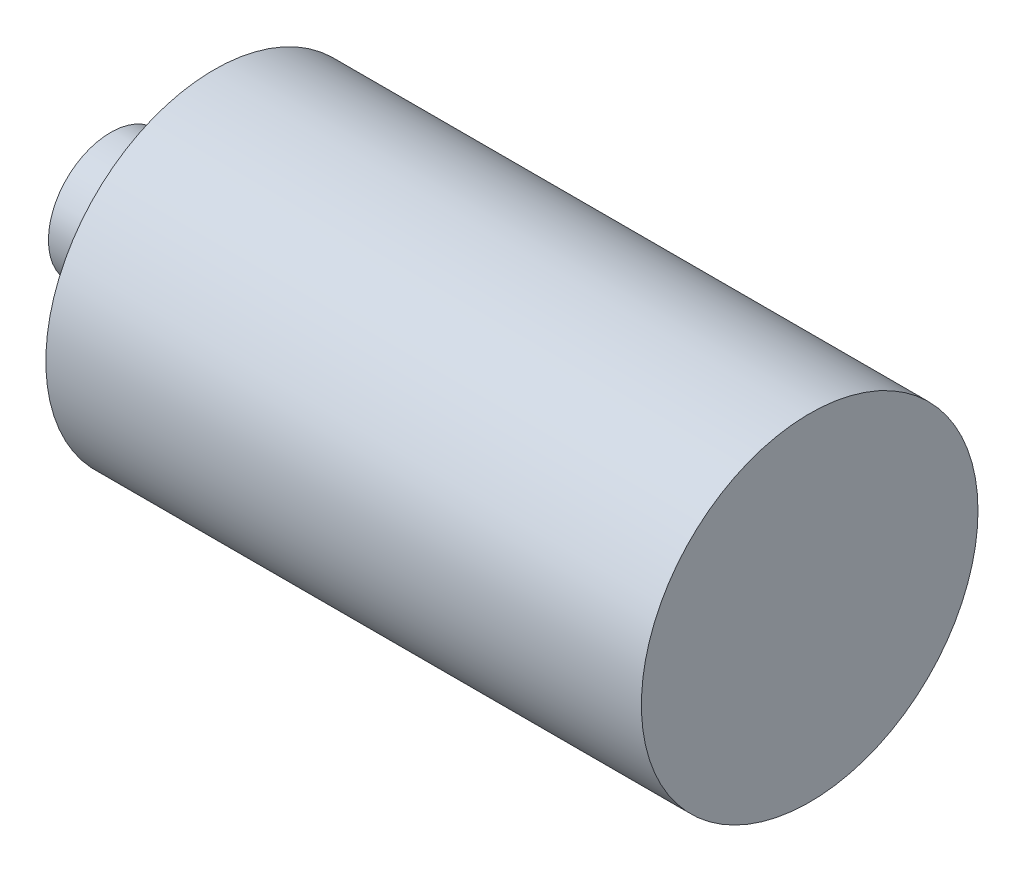
ISO-10303-21;
HEADER;
FILE_DESCRIPTION(('STEP AP214'),'2;1');
FILE_NAME('part.step','',(''),(''),'','','');
FILE_SCHEMA(('AUTOMOTIVE_DESIGN { 1 0 10303 214 1 1 1 1 }'));
ENDSEC;
DATA;
#1=APPLICATION_CONTEXT('core data for automotive mechanical design processes');
#2=APPLICATION_PROTOCOL_DEFINITION('international standard','automotive_design',2000,#1);
#3=PRODUCT_CONTEXT('',#1,'mechanical');
#4=PRODUCT('Part','Part','',(#3));
#5=PRODUCT_RELATED_PRODUCT_CATEGORY('part','',(#4));
#6=PRODUCT_DEFINITION_FORMATION('','',#4);
#7=PRODUCT_DEFINITION_CONTEXT('part definition',#1,'design');
#8=PRODUCT_DEFINITION('design','',#6,#7);
#9=PRODUCT_DEFINITION_SHAPE('','',#8);
#10=(LENGTH_UNIT() NAMED_UNIT(*) SI_UNIT(.MILLI.,.METRE.));
#11=(NAMED_UNIT(*) PLANE_ANGLE_UNIT() SI_UNIT($,.RADIAN.));
#12=(NAMED_UNIT(*) SI_UNIT($,.STERADIAN.) SOLID_ANGLE_UNIT());
#13=UNCERTAINTY_MEASURE_WITH_UNIT(LENGTH_MEASURE(1.E-05),#10,'distance_accuracy_value','');
#14=(GEOMETRIC_REPRESENTATION_CONTEXT(3) GLOBAL_UNCERTAINTY_ASSIGNED_CONTEXT((#13)) GLOBAL_UNIT_ASSIGNED_CONTEXT((#10,
#11,#12)) REPRESENTATION_CONTEXT('',''));
#15=CARTESIAN_POINT('',(0.,0.,0.));
#16=DIRECTION('',(0.,0.,1.));
#17=DIRECTION('',(1.,0.,0.));
#18=AXIS2_PLACEMENT_3D('',#15,#16,#17);
#19=CARTESIAN_POINT('',(11.5,0.,0.));
#20=DIRECTION('',(-1.,0.,0.));
#21=DIRECTION('',(0.,0.,1.));
#22=AXIS2_PLACEMENT_3D('',#19,#20,#21);
#23=CYLINDRICAL_SURFACE('',#22,3.25);
#24=CARTESIAN_POINT('',(11.5,0.,0.));
#25=DIRECTION('',(1.,0.,0.));
#26=DIRECTION('',(0.,0.,-1.));
#27=AXIS2_PLACEMENT_3D('',#24,#25,#26);
#28=CIRCLE('',#27,3.25);
#29=CARTESIAN_POINT('',(11.5,0.,-3.25));
#30=VERTEX_POINT('',#29);
#31=EDGE_CURVE('E38',#30,#30,#28,.T.);
#32=ORIENTED_EDGE('',*,*,#31,.F.);
#33=EDGE_LOOP('',(#32));
#34=FACE_BOUND('',#33,.T.);
#35=CARTESIAN_POINT('',(0.,0.,0.));
#36=DIRECTION('',(1.,0.,0.));
#37=DIRECTION('',(0.,0.,-1.));
#38=AXIS2_PLACEMENT_3D('',#35,#36,#37);
#39=CIRCLE('',#38,3.25);
#40=CARTESIAN_POINT('',(0.,0.,-3.25));
#41=VERTEX_POINT('',#40);
#42=EDGE_CURVE('E34',#41,#41,#39,.T.);
#43=ORIENTED_EDGE('',*,*,#42,.T.);
#44=EDGE_LOOP('',(#43));
#45=FACE_BOUND('',#44,.T.);
#46=ADVANCED_FACE('F31',(#34,#45),#23,.T.);
#47=CARTESIAN_POINT('',(11.5,0.,0.));
#48=DIRECTION('',(1.,0.,0.));
#49=DIRECTION('',(0.,0.,-1.));
#50=AXIS2_PLACEMENT_3D('',#47,#48,#49);
#51=PLANE('',#50);
#52=ORIENTED_EDGE('',*,*,#31,.T.);
#53=EDGE_LOOP('',(#52));
#54=FACE_BOUND('',#53,.T.);
#55=ADVANCED_FACE('F55',(#54),#51,.T.);
#56=CARTESIAN_POINT('',(0.,0.,0.));
#57=DIRECTION('',(1.,0.,0.));
#58=DIRECTION('',(0.,0.,-1.));
#59=AXIS2_PLACEMENT_3D('',#56,#57,#58);
#60=PLANE('',#59);
#61=CARTESIAN_POINT('',(0.,0.,0.));
#62=DIRECTION('',(-1.,0.,0.));
#63=DIRECTION('',(0.,0.,1.));
#64=AXIS2_PLACEMENT_3D('',#61,#62,#63);
#65=CIRCLE('',#64,1.2);
#66=CARTESIAN_POINT('',(0.,0.,1.2));
#67=VERTEX_POINT('',#66);
#68=EDGE_CURVE('E10',#67,#67,#65,.T.);
#69=ORIENTED_EDGE('',*,*,#68,.F.);
#70=EDGE_LOOP('',(#69));
#71=FACE_BOUND('',#70,.T.);
#72=ORIENTED_EDGE('',*,*,#42,.F.);
#73=EDGE_LOOP('',(#72));
#74=FACE_BOUND('',#73,.T.);
#75=ADVANCED_FACE('F52',(#71,#74),#60,.F.);
#76=CARTESIAN_POINT('',(-2.,0.,0.));
#77=DIRECTION('',(1.,0.,0.));
#78=DIRECTION('',(0.,0.,-1.));
#79=AXIS2_PLACEMENT_3D('',#76,#77,#78);
#80=CYLINDRICAL_SURFACE('',#79,1.2);
#81=CARTESIAN_POINT('',(-2.,0.,0.));
#82=DIRECTION('',(-1.,0.,0.));
#83=DIRECTION('',(0.,0.,1.));
#84=AXIS2_PLACEMENT_3D('',#81,#82,#83);
#85=CIRCLE('',#84,1.2);
#86=CARTESIAN_POINT('',(-2.,0.,1.2));
#87=VERTEX_POINT('',#86);
#88=EDGE_CURVE('E44',#87,#87,#85,.T.);
#89=ORIENTED_EDGE('',*,*,#88,.F.);
#90=EDGE_LOOP('',(#89));
#91=FACE_BOUND('',#90,.T.);
#92=ORIENTED_EDGE('',*,*,#68,.T.);
#93=EDGE_LOOP('',(#92));
#94=FACE_BOUND('',#93,.T.);
#95=ADVANCED_FACE('F54',(#91,#94),#80,.T.);
#96=CARTESIAN_POINT('',(-2.,0.,0.));
#97=DIRECTION('',(-1.,0.,0.));
#98=DIRECTION('',(0.,0.,1.));
#99=AXIS2_PLACEMENT_3D('',#96,#97,#98);
#100=PLANE('',#99);
#101=ORIENTED_EDGE('',*,*,#88,.T.);
#102=EDGE_LOOP('',(#101));
#103=FACE_BOUND('',#102,.T.);
#104=ADVANCED_FACE('F61',(#103),#100,.T.);
#105=CLOSED_SHELL('',(#46,#55,#75,#95,#104));
#106=MANIFOLD_SOLID_BREP('B2',#105);
#107=ADVANCED_BREP_SHAPE_REPRESENTATION('',(#18,#106),#14);
#108=SHAPE_DEFINITION_REPRESENTATION(#9,#107);
ENDSEC;
END-ISO-10303-21;
